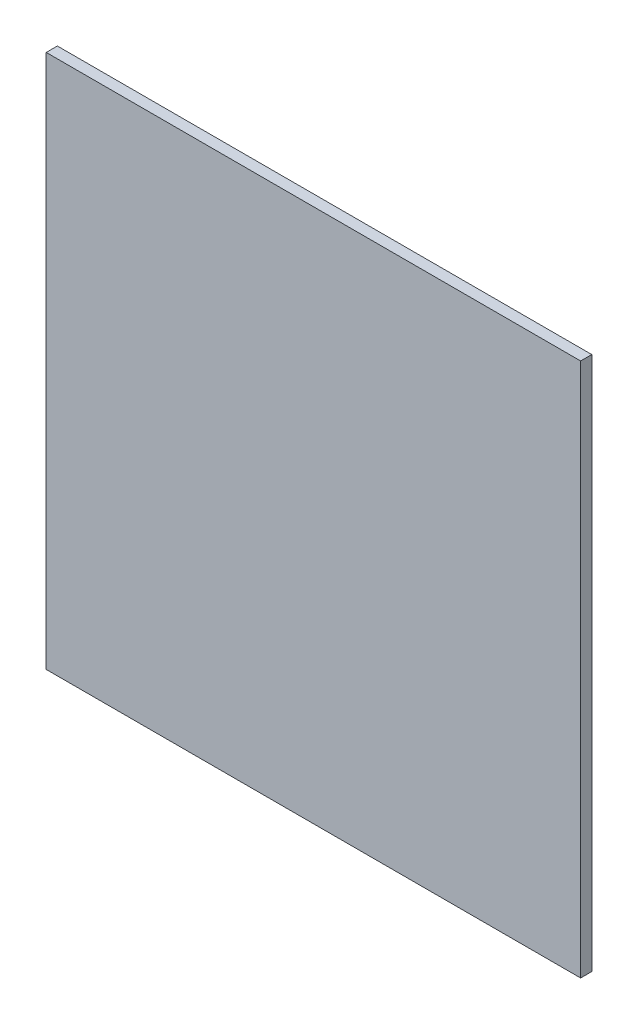
ISO-10303-21;
HEADER;
FILE_DESCRIPTION(('STEP AP214'),'2;1');
FILE_NAME('part.step','',(''),(''),'','','');
FILE_SCHEMA(('AUTOMOTIVE_DESIGN { 1 0 10303 214 1 1 1 1 }'));
ENDSEC;
DATA;
#1=APPLICATION_CONTEXT('core data for automotive mechanical design processes');
#2=APPLICATION_PROTOCOL_DEFINITION('international standard','automotive_design',2000,#1);
#3=PRODUCT_CONTEXT('',#1,'mechanical');
#4=PRODUCT('Part','Part','',(#3));
#5=PRODUCT_RELATED_PRODUCT_CATEGORY('part','',(#4));
#6=PRODUCT_DEFINITION_FORMATION('','',#4);
#7=PRODUCT_DEFINITION_CONTEXT('part definition',#1,'design');
#8=PRODUCT_DEFINITION('design','',#6,#7);
#9=PRODUCT_DEFINITION_SHAPE('','',#8);
#10=(LENGTH_UNIT() NAMED_UNIT(*) SI_UNIT(.MILLI.,.METRE.));
#11=(NAMED_UNIT(*) PLANE_ANGLE_UNIT() SI_UNIT($,.RADIAN.));
#12=(NAMED_UNIT(*) SI_UNIT($,.STERADIAN.) SOLID_ANGLE_UNIT());
#13=UNCERTAINTY_MEASURE_WITH_UNIT(LENGTH_MEASURE(1.E-05),#10,'distance_accuracy_value','');
#14=(GEOMETRIC_REPRESENTATION_CONTEXT(3) GLOBAL_UNCERTAINTY_ASSIGNED_CONTEXT((#13)) GLOBAL_UNIT_ASSIGNED_CONTEXT((#10,
#11,#12)) REPRESENTATION_CONTEXT('',''));
#15=CARTESIAN_POINT('',(0.,0.,0.));
#16=DIRECTION('',(0.,0.,1.));
#17=DIRECTION('',(1.,0.,0.));
#18=AXIS2_PLACEMENT_3D('',#15,#16,#17);
#19=CARTESIAN_POINT('',(0.,96.,2.));
#20=DIRECTION('',(0.,1.,0.));
#21=DIRECTION('',(0.,0.,1.));
#22=AXIS2_PLACEMENT_3D('',#19,#20,#21);
#23=PLANE('',#22);
#24=DIRECTION('',(1.,0.,0.));
#25=VECTOR('',#24,1.);
#26=CARTESIAN_POINT('',(0.,96.,0.));
#27=LINE('',#26,#25);
#28=CARTESIAN_POINT('',(0.,96.,0.));
#29=VERTEX_POINT('',#28);
#30=CARTESIAN_POINT('',(96.,96.,0.));
#31=VERTEX_POINT('',#30);
#32=EDGE_CURVE('E101',#29,#31,#27,.T.);
#33=ORIENTED_EDGE('',*,*,#32,.F.);
#34=DIRECTION('',(0.,0.,-1.));
#35=VECTOR('',#34,1.);
#36=CARTESIAN_POINT('',(0.,96.,2.));
#37=LINE('',#36,#35);
#38=CARTESIAN_POINT('',(0.,96.,2.));
#39=VERTEX_POINT('',#38);
#40=EDGE_CURVE('E11',#39,#29,#37,.T.);
#41=ORIENTED_EDGE('',*,*,#40,.F.);
#42=DIRECTION('',(1.,0.,0.));
#43=VECTOR('',#42,1.);
#44=CARTESIAN_POINT('',(0.,96.,2.));
#45=LINE('',#44,#43);
#46=CARTESIAN_POINT('',(96.,96.,2.));
#47=VERTEX_POINT('',#46);
#48=EDGE_CURVE('E95',#39,#47,#45,.T.);
#49=ORIENTED_EDGE('',*,*,#48,.T.);
#50=DIRECTION('',(0.,0.,-1.));
#51=VECTOR('',#50,1.);
#52=CARTESIAN_POINT('',(96.,96.,2.));
#53=LINE('',#52,#51);
#54=EDGE_CURVE('E40',#47,#31,#53,.T.);
#55=ORIENTED_EDGE('',*,*,#54,.T.);
#56=EDGE_LOOP('',(#33,#41,#49,#55));
#57=FACE_BOUND('',#56,.T.);
#58=ADVANCED_FACE('F37',(#57),#23,.T.);
#59=CARTESIAN_POINT('',(0.,0.,2.));
#60=DIRECTION('',(-1.,0.,0.));
#61=DIRECTION('',(0.,0.,1.));
#62=AXIS2_PLACEMENT_3D('',#59,#60,#61);
#63=PLANE('',#62);
#64=DIRECTION('',(0.,1.,0.));
#65=VECTOR('',#64,1.);
#66=CARTESIAN_POINT('',(0.,0.,0.));
#67=LINE('',#66,#65);
#68=CARTESIAN_POINT('',(0.,0.,0.));
#69=VERTEX_POINT('',#68);
#70=EDGE_CURVE('E97',#69,#29,#67,.T.);
#71=ORIENTED_EDGE('',*,*,#70,.F.);
#72=DIRECTION('',(0.,0.,-1.));
#73=VECTOR('',#72,1.);
#74=CARTESIAN_POINT('',(0.,0.,2.));
#75=LINE('',#74,#73);
#76=CARTESIAN_POINT('',(0.,0.,2.));
#77=VERTEX_POINT('',#76);
#78=EDGE_CURVE('E46',#77,#69,#75,.T.);
#79=ORIENTED_EDGE('',*,*,#78,.F.);
#80=DIRECTION('',(0.,1.,0.));
#81=VECTOR('',#80,1.);
#82=CARTESIAN_POINT('',(0.,0.,2.));
#83=LINE('',#82,#81);
#84=EDGE_CURVE('E85',#77,#39,#83,.T.);
#85=ORIENTED_EDGE('',*,*,#84,.T.);
#86=ORIENTED_EDGE('',*,*,#40,.T.);
#87=EDGE_LOOP('',(#71,#79,#85,#86));
#88=FACE_BOUND('',#87,.T.);
#89=ADVANCED_FACE('F111',(#88),#63,.T.);
#90=CARTESIAN_POINT('',(0.,0.,2.));
#91=DIRECTION('',(0.,1.,0.));
#92=DIRECTION('',(0.,0.,1.));
#93=AXIS2_PLACEMENT_3D('',#90,#91,#92);
#94=PLANE('',#93);
#95=DIRECTION('',(1.,0.,0.));
#96=VECTOR('',#95,1.);
#97=CARTESIAN_POINT('',(0.,0.,0.));
#98=LINE('',#97,#96);
#99=CARTESIAN_POINT('',(96.,0.,0.));
#100=VERTEX_POINT('',#99);
#101=EDGE_CURVE('E90',#69,#100,#98,.T.);
#102=ORIENTED_EDGE('',*,*,#101,.T.);
#103=DIRECTION('',(0.,0.,-1.));
#104=VECTOR('',#103,1.);
#105=CARTESIAN_POINT('',(96.,0.,2.));
#106=LINE('',#105,#104);
#107=CARTESIAN_POINT('',(96.,0.,2.));
#108=VERTEX_POINT('',#107);
#109=EDGE_CURVE('E88',#108,#100,#106,.T.);
#110=ORIENTED_EDGE('',*,*,#109,.F.);
#111=DIRECTION('',(1.,0.,0.));
#112=VECTOR('',#111,1.);
#113=CARTESIAN_POINT('',(0.,0.,2.));
#114=LINE('',#113,#112);
#115=EDGE_CURVE('E82',#77,#108,#114,.T.);
#116=ORIENTED_EDGE('',*,*,#115,.F.);
#117=ORIENTED_EDGE('',*,*,#78,.T.);
#118=EDGE_LOOP('',(#102,#110,#116,#117));
#119=FACE_BOUND('',#118,.T.);
#120=ADVANCED_FACE('F89',(#119),#94,.F.);
#121=CARTESIAN_POINT('',(96.,0.,2.));
#122=DIRECTION('',(-1.,0.,0.));
#123=DIRECTION('',(0.,0.,1.));
#124=AXIS2_PLACEMENT_3D('',#121,#122,#123);
#125=PLANE('',#124);
#126=DIRECTION('',(0.,1.,0.));
#127=VECTOR('',#126,1.);
#128=CARTESIAN_POINT('',(96.,0.,0.));
#129=LINE('',#128,#127);
#130=EDGE_CURVE('E104',#100,#31,#129,.T.);
#131=ORIENTED_EDGE('',*,*,#130,.T.);
#132=ORIENTED_EDGE('',*,*,#54,.F.);
#133=DIRECTION('',(0.,1.,0.));
#134=VECTOR('',#133,1.);
#135=CARTESIAN_POINT('',(96.,0.,2.));
#136=LINE('',#135,#134);
#137=EDGE_CURVE('E79',#108,#47,#136,.T.);
#138=ORIENTED_EDGE('',*,*,#137,.F.);
#139=ORIENTED_EDGE('',*,*,#109,.T.);
#140=EDGE_LOOP('',(#131,#132,#138,#139));
#141=FACE_BOUND('',#140,.T.);
#142=ADVANCED_FACE('F94',(#141),#125,.F.);
#143=CARTESIAN_POINT('',(0.,0.,2.));
#144=DIRECTION('',(0.,0.,1.));
#145=DIRECTION('',(1.,0.,0.));
#146=AXIS2_PLACEMENT_3D('',#143,#144,#145);
#147=PLANE('',#146);
#148=ORIENTED_EDGE('',*,*,#48,.F.);
#149=ORIENTED_EDGE('',*,*,#84,.F.);
#150=ORIENTED_EDGE('',*,*,#115,.T.);
#151=ORIENTED_EDGE('',*,*,#137,.T.);
#152=EDGE_LOOP('',(#148,#149,#150,#151));
#153=FACE_BOUND('',#152,.T.);
#154=ADVANCED_FACE('F84',(#153),#147,.T.);
#155=CARTESIAN_POINT('',(0.,0.,0.));
#156=DIRECTION('',(0.,0.,1.));
#157=DIRECTION('',(1.,0.,0.));
#158=AXIS2_PLACEMENT_3D('',#155,#156,#157);
#159=PLANE('',#158);
#160=ORIENTED_EDGE('',*,*,#32,.T.);
#161=ORIENTED_EDGE('',*,*,#130,.F.);
#162=ORIENTED_EDGE('',*,*,#101,.F.);
#163=ORIENTED_EDGE('',*,*,#70,.T.);
#164=EDGE_LOOP('',(#160,#161,#162,#163));
#165=FACE_BOUND('',#164,.T.);
#166=ADVANCED_FACE('F110',(#165),#159,.F.);
#167=CLOSED_SHELL('',(#58,#89,#120,#142,#154,#166));
#168=MANIFOLD_SOLID_BREP('B2',#167);
#169=ADVANCED_BREP_SHAPE_REPRESENTATION('',(#18,#168),#14);
#170=SHAPE_DEFINITION_REPRESENTATION(#9,#169);
ENDSEC;
END-ISO-10303-21;
